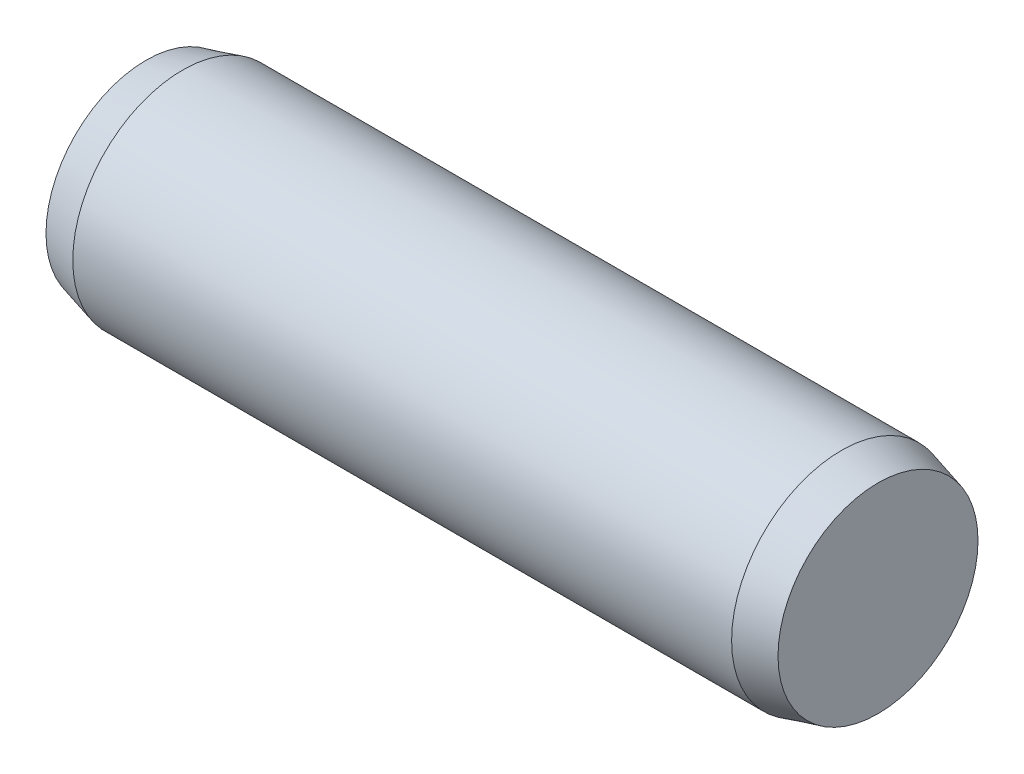
ISO-10303-21;
HEADER;
FILE_DESCRIPTION(('STEP AP214'),'2;1');
FILE_NAME('part.step','',(''),(''),'','','');
FILE_SCHEMA(('AUTOMOTIVE_DESIGN { 1 0 10303 214 1 1 1 1 }'));
ENDSEC;
DATA;
#1=APPLICATION_CONTEXT('core data for automotive mechanical design processes');
#2=APPLICATION_PROTOCOL_DEFINITION('international standard','automotive_design',2000,#1);
#3=PRODUCT_CONTEXT('',#1,'mechanical');
#4=PRODUCT('Part','Part','',(#3));
#5=PRODUCT_RELATED_PRODUCT_CATEGORY('part','',(#4));
#6=PRODUCT_DEFINITION_FORMATION('','',#4);
#7=PRODUCT_DEFINITION_CONTEXT('part definition',#1,'design');
#8=PRODUCT_DEFINITION('design','',#6,#7);
#9=PRODUCT_DEFINITION_SHAPE('','',#8);
#10=(LENGTH_UNIT() NAMED_UNIT(*) SI_UNIT(.MILLI.,.METRE.));
#11=(NAMED_UNIT(*) PLANE_ANGLE_UNIT() SI_UNIT($,.RADIAN.));
#12=(NAMED_UNIT(*) SI_UNIT($,.STERADIAN.) SOLID_ANGLE_UNIT());
#13=UNCERTAINTY_MEASURE_WITH_UNIT(LENGTH_MEASURE(1.E-05),#10,'distance_accuracy_value','');
#14=(GEOMETRIC_REPRESENTATION_CONTEXT(3) GLOBAL_UNCERTAINTY_ASSIGNED_CONTEXT((#13)) GLOBAL_UNIT_ASSIGNED_CONTEXT((#10,
#11,#12)) REPRESENTATION_CONTEXT('',''));
#15=CARTESIAN_POINT('',(0.,0.,0.));
#16=DIRECTION('',(0.,0.,1.));
#17=DIRECTION('',(1.,0.,0.));
#18=AXIS2_PLACEMENT_3D('',#15,#16,#17);
#19=CARTESIAN_POINT('',(0.,1.36602540378444,0.));
#20=DIRECTION('',(1.,0.,0.));
#21=DIRECTION('',(0.,0.,-1.));
#22=AXIS2_PLACEMENT_3D('',#19,#20,#21);
#23=PLANE('',#22);
#24=CARTESIAN_POINT('',(0.,0.,0.));
#25=DIRECTION('',(-1.,0.,0.));
#26=DIRECTION('',(0.,0.,1.));
#27=AXIS2_PLACEMENT_3D('',#24,#25,#26);
#28=CIRCLE('',#27,1.36602540378444);
#29=CARTESIAN_POINT('',(0.,0.,1.36602540378444));
#30=VERTEX_POINT('',#29);
#31=EDGE_CURVE('E10',#30,#30,#28,.T.);
#32=ORIENTED_EDGE('',*,*,#31,.T.);
#33=EDGE_LOOP('',(#32));
#34=FACE_BOUND('',#33,.T.);
#35=ADVANCED_FACE('F31',(#34),#23,.F.);
#36=CARTESIAN_POINT('',(0.5,0.,0.));
#37=DIRECTION('',(1.,0.,0.));
#38=DIRECTION('',(0.,0.,-1.));
#39=AXIS2_PLACEMENT_3D('',#36,#37,#38);
#40=CONICAL_SURFACE('',#39,1.5,0.261799387799144);
#41=ORIENTED_EDGE('',*,*,#31,.F.);
#42=EDGE_LOOP('',(#41));
#43=FACE_BOUND('',#42,.T.);
#44=CARTESIAN_POINT('',(0.5,0.,0.));
#45=DIRECTION('',(-1.,0.,0.));
#46=DIRECTION('',(0.,0.,1.));
#47=AXIS2_PLACEMENT_3D('',#44,#45,#46);
#48=CIRCLE('',#47,1.5);
#49=CARTESIAN_POINT('',(0.5,0.,1.5));
#50=VERTEX_POINT('',#49);
#51=EDGE_CURVE('E37',#50,#50,#48,.T.);
#52=ORIENTED_EDGE('',*,*,#51,.T.);
#53=EDGE_LOOP('',(#52));
#54=FACE_BOUND('',#53,.T.);
#55=ADVANCED_FACE('F63',(#43,#54),#40,.T.);
#56=CARTESIAN_POINT('',(-6.35,0.,0.));
#57=DIRECTION('',(-1.,0.,0.));
#58=DIRECTION('',(0.,0.,1.));
#59=AXIS2_PLACEMENT_3D('',#56,#57,#58);
#60=CYLINDRICAL_SURFACE('',#59,1.5);
#61=ORIENTED_EDGE('',*,*,#51,.F.);
#62=EDGE_LOOP('',(#61));
#63=FACE_BOUND('',#62,.T.);
#64=CARTESIAN_POINT('',(9.5,0.,0.));
#65=DIRECTION('',(-1.,0.,0.));
#66=DIRECTION('',(0.,0.,1.));
#67=AXIS2_PLACEMENT_3D('',#64,#65,#66);
#68=CIRCLE('',#67,1.5);
#69=CARTESIAN_POINT('',(9.5,0.,1.5));
#70=VERTEX_POINT('',#69);
#71=EDGE_CURVE('E41',#70,#70,#68,.T.);
#72=ORIENTED_EDGE('',*,*,#71,.T.);
#73=EDGE_LOOP('',(#72));
#74=FACE_BOUND('',#73,.T.);
#75=ADVANCED_FACE('F59',(#63,#74),#60,.T.);
#76=CARTESIAN_POINT('',(10.,0.,0.));
#77=DIRECTION('',(-1.,0.,0.));
#78=DIRECTION('',(0.,0.,1.));
#79=AXIS2_PLACEMENT_3D('',#76,#77,#78);
#80=CONICAL_SURFACE('',#79,1.36602540378444,0.26179938779915);
#81=ORIENTED_EDGE('',*,*,#71,.F.);
#82=EDGE_LOOP('',(#81));
#83=FACE_BOUND('',#82,.T.);
#84=CARTESIAN_POINT('',(10.,0.,0.));
#85=DIRECTION('',(-1.,0.,0.));
#86=DIRECTION('',(0.,0.,1.));
#87=AXIS2_PLACEMENT_3D('',#84,#85,#86);
#88=CIRCLE('',#87,1.36602540378444);
#89=CARTESIAN_POINT('',(10.,0.,1.36602540378444));
#90=VERTEX_POINT('',#89);
#91=EDGE_CURVE('E45',#90,#90,#88,.T.);
#92=ORIENTED_EDGE('',*,*,#91,.T.);
#93=EDGE_LOOP('',(#92));
#94=FACE_BOUND('',#93,.T.);
#95=ADVANCED_FACE('F51',(#83,#94),#80,.T.);
#96=CARTESIAN_POINT('',(10.,0.,0.));
#97=DIRECTION('',(-1.,0.,0.));
#98=DIRECTION('',(0.,0.,1.));
#99=AXIS2_PLACEMENT_3D('',#96,#97,#98);
#100=PLANE('',#99);
#101=ORIENTED_EDGE('',*,*,#91,.F.);
#102=EDGE_LOOP('',(#101));
#103=FACE_BOUND('',#102,.T.);
#104=ADVANCED_FACE('F53',(#103),#100,.F.);
#105=CLOSED_SHELL('',(#35,#55,#75,#95,#104));
#106=MANIFOLD_SOLID_BREP('B2',#105);
#107=ADVANCED_BREP_SHAPE_REPRESENTATION('',(#18,#106),#14);
#108=SHAPE_DEFINITION_REPRESENTATION(#9,#107);
ENDSEC;
END-ISO-10303-21;
